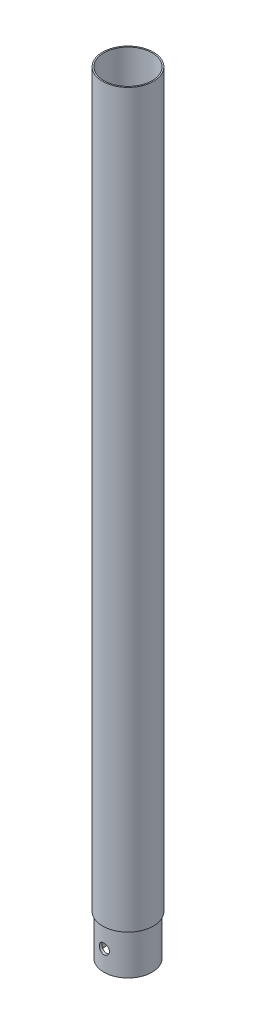
ISO-10303-21;
HEADER;
FILE_DESCRIPTION(('STEP AP214'),'2;1');
FILE_NAME('part.step','',(''),(''),'','','');
FILE_SCHEMA(('AUTOMOTIVE_DESIGN { 1 0 10303 214 1 1 1 1 }'));
ENDSEC;
DATA;
#1=APPLICATION_CONTEXT('core data for automotive mechanical design processes');
#2=APPLICATION_PROTOCOL_DEFINITION('international standard','automotive_design',2000,#1);
#3=PRODUCT_CONTEXT('',#1,'mechanical');
#4=PRODUCT('Part','Part','',(#3));
#5=PRODUCT_RELATED_PRODUCT_CATEGORY('part','',(#4));
#6=PRODUCT_DEFINITION_FORMATION('','',#4);
#7=PRODUCT_DEFINITION_CONTEXT('part definition',#1,'design');
#8=PRODUCT_DEFINITION('design','',#6,#7);
#9=PRODUCT_DEFINITION_SHAPE('','',#8);
#10=(LENGTH_UNIT() NAMED_UNIT(*) SI_UNIT(.MILLI.,.METRE.));
#11=(NAMED_UNIT(*) PLANE_ANGLE_UNIT() SI_UNIT($,.RADIAN.));
#12=(NAMED_UNIT(*) SI_UNIT($,.STERADIAN.) SOLID_ANGLE_UNIT());
#13=UNCERTAINTY_MEASURE_WITH_UNIT(LENGTH_MEASURE(1.E-05),#10,'distance_accuracy_value','');
#14=(GEOMETRIC_REPRESENTATION_CONTEXT(3) GLOBAL_UNCERTAINTY_ASSIGNED_CONTEXT((#13)) GLOBAL_UNIT_ASSIGNED_CONTEXT((#10,
#11,#12)) REPRESENTATION_CONTEXT('',''));
#15=CARTESIAN_POINT('',(0.,0.,0.));
#16=DIRECTION('',(0.,0.,1.));
#17=DIRECTION('',(1.,0.,0.));
#18=AXIS2_PLACEMENT_3D('',#15,#16,#17);
#19=CARTESIAN_POINT('',(0.,914.4,0.));
#20=DIRECTION('',(0.,-1.,0.));
#21=DIRECTION('',(0.,0.,-1.));
#22=AXIS2_PLACEMENT_3D('',#19,#20,#21);
#23=CYLINDRICAL_SURFACE('',#22,30.1625);
#24=CARTESIAN_POINT('',(0.,914.4,0.));
#25=DIRECTION('',(0.,1.,0.));
#26=DIRECTION('',(0.,0.,1.));
#27=AXIS2_PLACEMENT_3D('',#24,#25,#26);
#28=CIRCLE('',#27,30.1625);
#29=CARTESIAN_POINT('',(0.,914.4,30.1625));
#30=VERTEX_POINT('',#29);
#31=EDGE_CURVE('E56',#30,#30,#28,.T.);
#32=ORIENTED_EDGE('',*,*,#31,.T.);
#33=EDGE_LOOP('',(#32));
#34=FACE_BOUND('',#33,.T.);
#35=CARTESIAN_POINT('',(0.,25.4,0.));
#36=DIRECTION('',(0.,-1.,0.));
#37=DIRECTION('',(0.,0.,-1.));
#38=AXIS2_PLACEMENT_3D('',#35,#36,#37);
#39=CIRCLE('',#38,30.1625);
#40=CARTESIAN_POINT('',(0.,25.4,-30.1625));
#41=VERTEX_POINT('',#40);
#42=EDGE_CURVE('E121',#41,#41,#39,.T.);
#43=ORIENTED_EDGE('',*,*,#42,.T.);
#44=EDGE_LOOP('',(#43));
#45=FACE_BOUND('',#44,.T.);
#46=ADVANCED_FACE('F37',(#34,#45),#23,.F.);
#47=CARTESIAN_POINT('',(0.,914.4,0.));
#48=DIRECTION('',(0.,1.,0.));
#49=DIRECTION('',(0.,0.,1.));
#50=AXIS2_PLACEMENT_3D('',#47,#48,#49);
#51=PLANE('',#50);
#52=CARTESIAN_POINT('',(0.,914.4,0.));
#53=DIRECTION('',(0.,1.,0.));
#54=DIRECTION('',(0.,0.,1.));
#55=AXIS2_PLACEMENT_3D('',#52,#53,#54);
#56=CIRCLE('',#55,31.75);
#57=CARTESIAN_POINT('',(0.,914.4,31.75));
#58=VERTEX_POINT('',#57);
#59=EDGE_CURVE('E10',#58,#58,#56,.T.);
#60=ORIENTED_EDGE('',*,*,#59,.T.);
#61=EDGE_LOOP('',(#60));
#62=FACE_BOUND('',#61,.T.);
#63=ORIENTED_EDGE('',*,*,#31,.F.);
#64=EDGE_LOOP('',(#63));
#65=FACE_BOUND('',#64,.T.);
#66=ADVANCED_FACE('F97',(#62,#65),#51,.T.);
#67=CARTESIAN_POINT('',(0.,0.,0.));
#68=DIRECTION('',(0.,1.,0.));
#69=DIRECTION('',(0.,0.,1.));
#70=AXIS2_PLACEMENT_3D('',#67,#68,#69);
#71=PLANE('',#70);
#72=CARTESIAN_POINT('',(0.,0.,0.));
#73=DIRECTION('',(0.,1.,0.));
#74=DIRECTION('',(0.,0.,1.));
#75=AXIS2_PLACEMENT_3D('',#72,#73,#74);
#76=CIRCLE('',#75,31.75);
#77=CARTESIAN_POINT('',(0.,0.,31.75));
#78=VERTEX_POINT('',#77);
#79=EDGE_CURVE('E50',#78,#78,#76,.T.);
#80=ORIENTED_EDGE('',*,*,#79,.F.);
#81=EDGE_LOOP('',(#80));
#82=FACE_BOUND('',#81,.T.);
#83=CARTESIAN_POINT('',(0.,0.,0.));
#84=DIRECTION('',(0.,1.,0.));
#85=DIRECTION('',(0.,0.,1.));
#86=AXIS2_PLACEMENT_3D('',#83,#84,#85);
#87=CIRCLE('',#86,30.1625);
#88=CARTESIAN_POINT('',(0.,0.,30.1625));
#89=VERTEX_POINT('',#88);
#90=EDGE_CURVE('E111',#89,#89,#87,.F.);
#91=ORIENTED_EDGE('',*,*,#90,.F.);
#92=EDGE_LOOP('',(#91));
#93=FACE_BOUND('',#92,.T.);
#94=ADVANCED_FACE('F100',(#82,#93),#71,.F.);
#95=CARTESIAN_POINT('',(0.,914.4,0.));
#96=DIRECTION('',(0.,-1.,0.));
#97=DIRECTION('',(0.,0.,-1.));
#98=AXIS2_PLACEMENT_3D('',#95,#96,#97);
#99=CYLINDRICAL_SURFACE('',#98,31.75);
#100=ORIENTED_EDGE('',*,*,#59,.F.);
#101=EDGE_LOOP('',(#100));
#102=FACE_BOUND('',#101,.T.);
#103=ORIENTED_EDGE('',*,*,#79,.T.);
#104=EDGE_LOOP('',(#103));
#105=FACE_BOUND('',#104,.T.);
#106=ADVANCED_FACE('F39',(#102,#105),#99,.T.);
#107=CARTESIAN_POINT('',(0.,-50.8,0.));
#108=DIRECTION('',(0.,1.,0.));
#109=DIRECTION('',(0.,0.,1.));
#110=AXIS2_PLACEMENT_3D('',#107,#108,#109);
#111=CYLINDRICAL_SURFACE('',#110,30.1625);
#112=CARTESIAN_POINT('',(0.,-31.75,30.1625));
#113=CARTESIAN_POINT('',(-0.176315105581047,-31.7500038197238,30.1625020231407));
#114=CARTESIAN_POINT('',(-0.352583630866825,-31.7426548614869,30.1609514173855));
#115=CARTESIAN_POINT('',(-0.703897789038372,-31.7133258197453,30.1547967086032));
#116=CARTESIAN_POINT('',(-0.8789432238277,-31.6913434192252,30.1501921220184));
#117=CARTESIAN_POINT('',(-1.22657599671622,-31.6329046151628,30.1380522865016));
#118=CARTESIAN_POINT('',(-1.39916212229057,-31.5964413115052,30.1305156404852));
#119=CARTESIAN_POINT('',(-1.74063668820986,-31.5093160171708,30.112718738428));
#120=CARTESIAN_POINT('',(-1.90952374408857,-31.4586488050342,30.1024574808736));
#121=CARTESIAN_POINT('',(-2.24212101529348,-31.343594562264,30.0795121681272));
#122=CARTESIAN_POINT('',(-2.40583811162263,-31.2792267339408,30.0668315064394));
#123=CARTESIAN_POINT('',(-2.72728401378382,-31.1371865356579,30.0393801713236));
#124=CARTESIAN_POINT('',(-2.88501058459432,-31.0595092584672,30.0246087273689));
#125=CARTESIAN_POINT('',(-3.19328883502723,-30.8914672086765,29.9933877501161));
#126=CARTESIAN_POINT('',(-3.34384356997194,-30.8011079047624,29.9769389409554));
#127=CARTESIAN_POINT('',(-3.63691437027288,-30.6082756110029,29.9427960683608));
#128=CARTESIAN_POINT('',(-3.77942740100862,-30.5057980927871,29.9251015404287));
#129=CARTESIAN_POINT('',(-4.05722294406256,-30.2880458405658,29.8887140855167));
#130=CARTESIAN_POINT('',(-4.1923872320363,-30.1726219290865,29.8700111626939));
#131=CARTESIAN_POINT('',(-4.4525975028409,-29.9308311362274,29.8323327103976));
#132=CARTESIAN_POINT('',(-4.5776397166077,-29.8044602145386,29.8133570824482));
#133=CARTESIAN_POINT('',(-4.81667675278572,-29.5416978740834,29.7756724710714));
#134=CARTESIAN_POINT('',(-4.93067468377867,-29.405309294053,29.7569634138857));
#135=CARTESIAN_POINT('',(-5.14692431455582,-29.1233386105723,29.720323204076));
#136=CARTESIAN_POINT('',(-5.24917166601173,-28.9777531344763,29.7023923409424));
#137=CARTESIAN_POINT('',(-5.44209942500296,-28.6769332506845,29.6676535448939));
#138=CARTESIAN_POINT('',(-5.53265630322925,-28.5216180886506,29.6508583771763));
#139=CARTESIAN_POINT('',(-5.70037480860366,-28.2036677315623,29.6190719167317));
#140=CARTESIAN_POINT('',(-5.77753140262471,-28.041029814849,29.6040813024381));
#141=CARTESIAN_POINT('',(-5.9177864070758,-27.7096813827476,29.576364509607));
#142=CARTESIAN_POINT('',(-5.98089123313174,-27.540973679684,29.5636372982026));
#143=CARTESIAN_POINT('',(-6.0926059238663,-27.1986540259453,29.5408150837068));
#144=CARTESIAN_POINT('',(-6.14121054241279,-27.0250403251037,29.5307210334509));
#145=CARTESIAN_POINT('',(-6.2633701327077,-26.5037887429272,29.5051501977688));
#146=CARTESIAN_POINT('',(-6.31547177218477,-26.1505200579255,29.493933901796));
#147=CARTESIAN_POINT('',(-6.34875323458613,-25.6182800597736,29.4867710600427));
#148=CARTESIAN_POINT('',(-6.35236099804858,-25.4404054966268,29.4859953409579));
#149=CARTESIAN_POINT('',(-6.34466946257648,-25.0849720693957,29.4876516760316));
#150=CARTESIAN_POINT('',(-6.33336995069971,-24.9074132098574,29.490083776012));
#151=CARTESIAN_POINT('',(-6.27777817644327,-24.383228222685,29.5019937841399));
#152=CARTESIAN_POINT('',(-6.21217509172752,-24.0387250780082,29.5160050568088));
#153=CARTESIAN_POINT('',(-6.02553232151055,-23.365907889115,29.5546656900087));
#154=CARTESIAN_POINT('',(-5.9044897321428,-23.0375946939101,29.5793156077776));
#155=CARTESIAN_POINT('',(-5.60947409053115,-22.4034275223133,29.636681065321));
#156=CARTESIAN_POINT('',(-5.43511465051721,-22.0977584336578,29.6694551412393));
#157=CARTESIAN_POINT('',(-5.03868775423322,-21.5196610271918,29.7393412462841));
#158=CARTESIAN_POINT('',(-4.81661425005183,-21.2472369301612,29.7764538250576));
#159=CARTESIAN_POINT('',(-4.32578890271529,-20.7376333190208,29.8517451097226));
#160=CARTESIAN_POINT('',(-4.05619277705206,-20.5012671109709,29.8899302981544));
#161=CARTESIAN_POINT('',(-3.48076362784373,-20.0769772594501,29.962387227403));
#162=CARTESIAN_POINT('',(-3.17493003826804,-19.8890543728113,29.9966589070742));
#163=CARTESIAN_POINT('',(-2.53475473172088,-19.5668061630512,30.0575259987328));
#164=CARTESIAN_POINT('',(-2.20036098126263,-19.4325813133261,30.0841069953545));
#165=CARTESIAN_POINT('',(-1.51308346797583,-19.2224472855836,30.126489708063));
#166=CARTESIAN_POINT('',(-1.16020219877873,-19.1465302644177,30.1422928738738));
#167=CARTESIAN_POINT('',(-0.452949245360638,-19.0563356919567,30.1611349793477));
#168=CARTESIAN_POINT('',(-0.0987253228146216,-19.0409461597901,30.1644041585858));
#169=CARTESIAN_POINT('',(0.607231988982623,-19.069238200403,30.158452587199));
#170=CARTESIAN_POINT('',(0.958965532733967,-19.1129160758539,30.1492326183332));
#171=CARTESIAN_POINT('',(1.64631670192574,-19.2571797995832,30.1194834755954));
#172=CARTESIAN_POINT('',(1.98206095756056,-19.3571880888697,30.0990691336067));
#173=CARTESIAN_POINT('',(2.63201209537692,-19.6106384055554,30.0492139250055));
#174=CARTESIAN_POINT('',(2.9462172360319,-19.764084747558,30.0197723295529));
#175=CARTESIAN_POINT('',(3.54880901660522,-20.1224072900557,29.9545578294416));
#176=CARTESIAN_POINT('',(3.8367940812587,-20.3279439762805,29.9187055031452));
#177=CARTESIAN_POINT('',(4.37458849974109,-20.783753999732,29.844818666477));
#178=CARTESIAN_POINT('',(4.62439327841342,-21.034032690624,29.806783895332));
#179=CARTESIAN_POINT('',(5.08306808898007,-21.5772414172944,29.7320340135307));
#180=CARTESIAN_POINT('',(5.29117075575876,-21.8708236985533,29.695352291141));
#181=CARTESIAN_POINT('',(5.65516259700216,-22.4896277032298,29.6281962475143));
#182=CARTESIAN_POINT('',(5.81105396539953,-22.8148480964643,29.5977216654726));
#183=CARTESIAN_POINT('',(6.00171138025364,-23.3181531115434,29.5594306086357));
#184=CARTESIAN_POINT('',(6.05798943106914,-23.4881042506157,29.547921198351));
#185=CARTESIAN_POINT('',(6.15603205146513,-23.8322866813607,29.5276516233052));
#186=CARTESIAN_POINT('',(6.19780197884528,-24.0065163674756,29.518890443748));
#187=CARTESIAN_POINT('',(6.26648482846388,-24.3580053657795,29.5043861459545));
#188=CARTESIAN_POINT('',(6.29339667556468,-24.5352648962528,29.4986432461238));
#189=CARTESIAN_POINT('',(6.33214158482362,-24.8914967282123,29.4903507157791));
#190=CARTESIAN_POINT('',(6.34397523447174,-25.0704689626928,29.4878009608511));
#191=CARTESIAN_POINT('',(6.35237772348669,-25.4251718698303,29.4859919192306));
#192=CARTESIAN_POINT('',(6.34924961534649,-25.6008951202917,29.4866673063804));
#193=CARTESIAN_POINT('',(6.3284472667739,-25.9514357677677,29.491138915751));
#194=CARTESIAN_POINT('',(6.31077331058212,-26.1262531824161,29.4949350769887));
#195=CARTESIAN_POINT('',(6.26101842486044,-26.4737614180177,29.5055367648539));
#196=CARTESIAN_POINT('',(6.22893509463876,-26.6464518796796,29.5123427929412));
#197=CARTESIAN_POINT('',(6.1506305563073,-26.9883945531221,29.5287613574746));
#198=CARTESIAN_POINT('',(6.1044143780484,-27.1576479653246,29.5383728953905));
#199=CARTESIAN_POINT('',(5.99834014794418,-27.4911613434239,29.5600954258912));
#200=CARTESIAN_POINT('',(5.93851856446133,-27.6554333512606,29.5721997287382));
#201=CARTESIAN_POINT('',(5.80563709200432,-27.9782823954543,29.5985737402857));
#202=CARTESIAN_POINT('',(5.7325818677565,-28.1368614150079,29.6128426856842));
#203=CARTESIAN_POINT('',(5.573713318327,-28.447400782635,29.6431554436397));
#204=CARTESIAN_POINT('',(5.48789460435568,-28.5993582998784,29.6592000051323));
#205=CARTESIAN_POINT('',(5.30415363599656,-28.8955423551511,29.6926097379869));
#206=CARTESIAN_POINT('',(5.206235499775,-29.0397714997831,29.7099744592486));
#207=CARTESIAN_POINT('',(4.99694772485927,-29.322309111402,29.745897252342));
#208=CARTESIAN_POINT('',(4.88535643217662,-29.4604513448569,29.7644718069787));
#209=CARTESIAN_POINT('',(4.65107056987712,-29.7268342731341,29.8019800349832));
#210=CARTESIAN_POINT('',(4.52837989048098,-29.8550784081577,29.8209135807034));
#211=CARTESIAN_POINT('',(4.27260929921923,-30.1009354239142,29.8586324487833));
#212=CARTESIAN_POINT('',(4.13952328824615,-30.2185419747568,29.8774176768978));
#213=CARTESIAN_POINT('',(3.86396396818016,-30.4421979437339,29.9143026256864));
#214=CARTESIAN_POINT('',(3.72149412610624,-30.5482515922791,29.9324025956917));
#215=CARTESIAN_POINT('',(3.42627478682687,-30.7493388090298,29.9676393715762));
#216=CARTESIAN_POINT('',(3.27342085374657,-30.8442216881643,29.9847616854536));
#217=CARTESIAN_POINT('',(2.96013530544962,-31.0207129077949,30.0173083006279));
#218=CARTESIAN_POINT('',(2.79970651008203,-31.102326138607,30.0327332267893));
#219=CARTESIAN_POINT('',(2.47242690886246,-31.2516605860783,30.0614448140426));
#220=CARTESIAN_POINT('',(2.30557984372941,-31.3193897532632,30.0747326979389));
#221=CARTESIAN_POINT('',(1.96663020987741,-31.4404689938892,30.0987984120681));
#222=CARTESIAN_POINT('',(1.79452861884826,-31.4938217243652,30.1095767060701));
#223=CARTESIAN_POINT('',(1.35660918173222,-31.6093837089532,30.13313145727));
#224=CARTESIAN_POINT('',(1.08810836381504,-31.6620393420907,30.1440853549386));
#225=CARTESIAN_POINT('',(0.546367649735176,-31.7323438568515,30.1587679205484));
#226=CARTESIAN_POINT('',(0.27312793598277,-31.7499940829047,30.1624968659733));
#227=CARTESIAN_POINT('',(0.,-31.75,30.1625));
#228=B_SPLINE_CURVE_WITH_KNOTS('',3,(#112,#113,#114,#115,#116,#117,#118,#119,#120,#121,#122,
#123,#124,#125,#126,#127,#128,#129,#130,#131,#132,#133,#134,#135,#136,#137,#138,#139,#140,#141,
#142,#143,#144,#145,#146,#147,#148,#149,#150,#151,#152,#153,#154,#155,#156,#157,#158,#159,#160,
#161,#162,#163,#164,#165,#166,#167,#168,#169,#170,#171,#172,#173,#174,#175,#176,#177,#178,#179,
#180,#181,#182,#183,#184,#185,#186,#187,#188,#189,#190,#191,#192,#193,#194,#195,#196,#197,#198,
#199,#200,#201,#202,#203,#204,#205,#206,#207,#208,#209,#210,#211,#212,#213,#214,#215,#216,#217,
#218,#219,#220,#221,#222,#223,#224,#225,#226,#227),.UNSPECIFIED.,.T.,.F.,(4,2,2,2,2,2,2,2,2,2,2,
2,2,2,2,2,2,2,2,2,2,2,2,2,2,2,2,2,2,2,2,2,2,2,2,2,2,2,2,2,2,2,2,2,2,2,2,2,2,2,2,2,2,2,2,2,2,4),
(0.,0.528705328684641,1.05749439090057,1.58653572272344,2.11577178958024,2.64427092512803,
3.17296534074927,3.70143247164451,4.23009770948944,4.76564250251184,5.30138580282144,
5.8369778692316,6.37276749880098,6.91382181732159,7.45507891761494,7.99608838673802,
8.53729335476716,9.60286640188286,10.1360803671133,10.6693019490939,11.7168539086147,
12.7644607441494,13.8198471306622,14.8753673698013,15.9519853113769,17.0286200719844,
18.1072599864553,19.1857547846418,20.2443408140686,21.302860584297,22.3507198413266,
23.3986637224264,24.4606252144195,25.5227138620145,26.6028425624871,27.6829258699679,
28.2205738329393,28.7580230327478,29.2955111175363,29.8329782596011,30.3596055784277,
30.8862226066676,31.4129274051618,31.9394449682613,32.4645675311248,32.98950535244,
33.514665436817,34.0396472672245,34.5746806868894,35.1095273040407,35.6446901160257,
36.1796563000905,36.7211671142186,37.2624779086586,37.8034778573481,38.3443777504215,
39.1634212523893,39.9824332972782),.UNSPECIFIED.);
#229=CARTESIAN_POINT('',(0.,-31.75,30.1625));
#230=VERTEX_POINT('',#229);
#231=EDGE_CURVE('E84',#230,#230,#228,.T.);
#232=ORIENTED_EDGE('',*,*,#231,.T.);
#233=EDGE_LOOP('',(#232));
#234=FACE_BOUND('',#233,.T.);
#235=CARTESIAN_POINT('',(6.35,-25.4,-29.4865037983482));
#236=CARTESIAN_POINT('',(6.35000383665806,-25.2237335940409,-29.4865016033478));
#237=CARTESIAN_POINT('',(6.34265889203041,-25.0475137908717,-29.488087229197));
#238=CARTESIAN_POINT('',(6.31334629621443,-24.6962984088657,-29.4943776030288));
#239=CARTESIAN_POINT('',(6.29137632424732,-24.5213030287814,-29.4990828460487));
#240=CARTESIAN_POINT('',(6.23297149470894,-24.1737713847186,-29.5114783841454));
#241=CARTESIAN_POINT('',(6.19652965960528,-24.0012363486114,-29.5191701191035));
#242=CARTESIAN_POINT('',(6.10945733313258,-23.6598650965947,-29.5373139375905));
#243=CARTESIAN_POINT('',(6.05882161419217,-23.4910302682101,-29.5477670380413));
#244=CARTESIAN_POINT('',(5.94384340624219,-23.1585441551787,-29.5711102975904));
#245=CARTESIAN_POINT('',(5.8795207468832,-22.9948857607659,-29.5839969279812));
#246=CARTESIAN_POINT('',(5.73758185121118,-22.6735523688274,-29.6118521851701));
#247=CARTESIAN_POINT('',(5.65996070951486,-22.5158796055198,-29.6268215798491));
#248=CARTESIAN_POINT('',(5.49203959297024,-22.207699633984,-29.658408572995));
#249=CARTESIAN_POINT('',(5.40174503043408,-22.0571894034747,-29.675025466996));
#250=CARTESIAN_POINT('',(5.20904828502576,-21.7641957467521,-29.7094564303587));
#251=CARTESIAN_POINT('',(5.10664157487713,-21.6217153514967,-29.7272709462867));
#252=CARTESIAN_POINT('',(4.88896093590215,-21.3438774473538,-29.7638507239633));
#253=CARTESIAN_POINT('',(4.77353001414538,-21.2086441904622,-29.7826256642304));
#254=CARTESIAN_POINT('',(4.53171059599173,-20.9482951715349,-29.8203786408225));
#255=CARTESIAN_POINT('',(4.40531805298798,-20.8231831791044,-29.839356749864));
#256=CARTESIAN_POINT('',(4.14249851202326,-20.5840093612508,-29.8769765018139));
#257=CARTESIAN_POINT('',(4.00607444646209,-20.4699443290098,-29.8956182410807));
#258=CARTESIAN_POINT('',(3.72401887700792,-20.2535653486952,-29.9320616588801));
#259=CARTESIAN_POINT('',(3.57838399901281,-20.1512557459778,-29.9498630253484));
#260=CARTESIAN_POINT('',(3.27752308781767,-19.9582559246085,-29.9842855449464));
#261=CARTESIAN_POINT('',(3.12222003204956,-19.8676834431951,-30.0008940898636));
#262=CARTESIAN_POINT('',(2.80429233690028,-19.6999325199551,-30.0322807066711));
#263=CARTESIAN_POINT('',(2.64166497575117,-19.6227591099187,-30.0470580903066));
#264=CARTESIAN_POINT('',(2.31033793468708,-19.4824699557545,-30.0743465194566));
#265=CARTESIAN_POINT('',(2.14164103429334,-19.4193478697127,-30.0868585869193));
#266=CARTESIAN_POINT('',(1.79934571761723,-19.307598519863,-30.1092729209882));
#267=CARTESIAN_POINT('',(1.62574555002334,-19.2589765086216,-30.1191742417167));
#268=CARTESIAN_POINT('',(1.10457254652848,-19.1367710214193,-30.1442407378092));
#269=CARTESIAN_POINT('',(0.751376656671362,-19.0846338787608,-30.1552136910014));
#270=CARTESIAN_POINT('',(0.219244251289241,-19.0512809828075,-30.1622314582826));
#271=CARTESIAN_POINT('',(0.0414048725291179,-19.0476464089707,-30.1629955058067));
#272=CARTESIAN_POINT('',(-0.313961529573228,-19.0552786181092,-30.161388766788));
#273=CARTESIAN_POINT('',(-0.491488548184789,-19.0665456248551,-30.1590179331702));
#274=CARTESIAN_POINT('',(-1.015953437635,-19.12207246124,-30.1473829002697));
#275=CARTESIAN_POINT('',(-1.36077195582299,-19.1876965767385,-30.1336706056871));
#276=CARTESIAN_POINT('',(-2.03420894869433,-19.3744888849476,-30.095721967219));
#277=CARTESIAN_POINT('',(-2.36282672670044,-19.4956594640083,-30.0714851711894));
#278=CARTESIAN_POINT('',(-2.99738097422117,-19.7909492757365,-30.0149010012309));
#279=CARTESIAN_POINT('',(-3.30314610147263,-19.9654265692809,-29.9824990481209));
#280=CARTESIAN_POINT('',(-3.88138660849828,-20.3621100264074,-29.9131444896976));
#281=CARTESIAN_POINT('',(-4.15385776004847,-20.5843222423028,-29.8761913075875));
#282=CARTESIAN_POINT('',(-4.66332240686298,-21.075252240162,-29.8009650192243));
#283=CARTESIAN_POINT('',(-4.89952999090333,-21.344784560054,-29.7626802024323));
#284=CARTESIAN_POINT('',(-5.32352935017676,-21.9200274722244,-29.6897771292723));
#285=CARTESIAN_POINT('',(-5.5113200005451,-22.225738904807,-29.655158958102));
#286=CARTESIAN_POINT('',(-5.83346996153975,-22.8658689014871,-29.5934812505656));
#287=CARTESIAN_POINT('',(-5.96769032173499,-23.2003594190231,-29.5664414242292));
#288=CARTESIAN_POINT('',(-6.17778632937599,-23.8878489745664,-29.5232617556119));
#289=CARTESIAN_POINT('',(-6.25367048422846,-24.2408453057717,-29.5071203240155));
#290=CARTESIAN_POINT('',(-6.34374098447686,-24.9481704429702,-29.4878866611643));
#291=CARTESIAN_POINT('',(-6.35906754463862,-25.3023476636831,-29.4845533052486));
#292=CARTESIAN_POINT('',(-6.33066626602637,-26.0081969634689,-29.4906642086807));
#293=CARTESIAN_POINT('',(-6.2869421638387,-26.359869199636,-29.5001076595426));
#294=CARTESIAN_POINT('',(-6.14266757516395,-27.0468175166569,-29.5304812703195));
#295=CARTESIAN_POINT('',(-6.04273665172115,-27.3822297693147,-29.5512861229253));
#296=CARTESIAN_POINT('',(-5.7895509236459,-28.0315507562823,-29.6019267726508));
#297=CARTESIAN_POINT('',(-5.63629132869544,-28.3454575558039,-29.6317633810285));
#298=CARTESIAN_POINT('',(-5.27826044584435,-28.9478147185362,-29.6976406950828));
#299=CARTESIAN_POINT('',(-5.07278185285756,-29.2358353814199,-29.7337642482826));
#300=CARTESIAN_POINT('',(-4.61706154490053,-29.773728244385,-29.8079233322263));
#301=CARTESIAN_POINT('',(-4.36681469952246,-30.0235960660902,-29.8459590817467));
#302=CARTESIAN_POINT('',(-3.823585915029,-30.4824523772657,-29.9204443805716));
#303=CARTESIAN_POINT('',(-3.52994454866826,-30.6906661154427,-29.9568555289082));
#304=CARTESIAN_POINT('',(-2.91098851988656,-31.0548526582966,-30.0233079109972));
#305=CARTESIAN_POINT('',(-2.5856752752762,-31.2108278000789,-30.0533494296988));
#306=CARTESIAN_POINT('',(-2.08233454762094,-31.4015405481039,-30.091006139156));
#307=CARTESIAN_POINT('',(-1.91244492567754,-31.4578142642266,-30.1023046581251));
#308=CARTESIAN_POINT('',(-1.56839154663493,-31.5558574807939,-30.1221870584343));
#309=CARTESIAN_POINT('',(-1.39422938932691,-31.5976323239979,-30.1307719396316));
#310=CARTESIAN_POINT('',(-1.04287856401566,-31.6663359376382,-30.1449788216831));
#311=CARTESIAN_POINT('',(-0.865689646837443,-31.6932634796535,-30.1506005773755));
#312=CARTESIAN_POINT('',(-0.509600888156586,-31.7320514053268,-30.1587204347631));
#313=CARTESIAN_POINT('',(-0.330701111836807,-31.743912360728,-30.1612186549895));
#314=CARTESIAN_POINT('',(0.0240213956486572,-31.7523847115909,-30.1630018891919));
#315=CARTESIAN_POINT('',(0.199836989502212,-31.7492855640324,-30.1623478944705));
#316=CARTESIAN_POINT('',(0.550565432444156,-31.7285256116079,-30.1579846742846));
#317=CARTESIAN_POINT('',(0.725478299096514,-31.710865091139,-30.1542755084904));
#318=CARTESIAN_POINT('',(1.07317980985837,-31.6611207905052,-30.1439040163807));
#319=CARTESIAN_POINT('',(1.24596810415535,-31.6290346669768,-30.1372412102643));
#320=CARTESIAN_POINT('',(1.58810802888464,-31.550707352784,-30.1211493878471));
#321=CARTESIAN_POINT('',(1.75746086202981,-31.5044712103491,-30.1117213581307));
#322=CARTESIAN_POINT('',(2.09120621034594,-31.3983285461626,-30.0903831475907));
#323=CARTESIAN_POINT('',(2.25560983762345,-31.338455713202,-30.0784790898611));
#324=CARTESIAN_POINT('',(2.57871458866101,-31.2054494015714,-30.0525023784537));
#325=CARTESIAN_POINT('',(2.73741770230726,-31.1323206051517,-30.0384304907559));
#326=CARTESIAN_POINT('',(3.0481921851999,-30.9732850060235,-30.0084873591275));
#327=CARTESIAN_POINT('',(3.2002607506866,-30.8873728674386,-29.9926153644779));
#328=CARTESIAN_POINT('',(3.49664977748638,-30.7034282789305,-29.9595073200284));
#329=CARTESIAN_POINT('',(3.64097285783728,-30.6053999634474,-29.9422717362487));
#330=CARTESIAN_POINT('',(3.92353092367131,-30.3959868270567,-29.9065704760572));
#331=CARTESIAN_POINT('',(4.06160857506198,-30.2843924916995,-29.8880881891369));
#332=CARTESIAN_POINT('',(4.32786021630942,-30.0501139665211,-29.8506968537379));
#333=CARTESIAN_POINT('',(4.45603764735268,-29.9274336625037,-29.831787956523));
#334=CARTESIAN_POINT('',(4.70176192334798,-29.6716973760458,-29.7940481553058));
#335=CARTESIAN_POINT('',(4.81930236005058,-29.5386352277723,-29.7752173047549));
#336=CARTESIAN_POINT('',(5.0428289337983,-29.2631374724938,-29.7381760730669));
#337=CARTESIAN_POINT('',(5.14881928945951,-29.1207053185312,-29.7199654670702));
#338=CARTESIAN_POINT('',(5.34982101535136,-28.8255214264559,-29.6844466460006));
#339=CARTESIAN_POINT('',(5.44467734770877,-28.6726623354513,-29.6671526797663));
#340=CARTESIAN_POINT('',(5.62111538615028,-28.3593703324646,-29.6342288907603));
#341=CARTESIAN_POINT('',(5.70270198239748,-28.1989402387961,-29.6185984556815));
#342=CARTESIAN_POINT('',(5.85198424317087,-27.8716599404104,-29.5894656168797));
#343=CARTESIAN_POINT('',(5.91968793561648,-27.7048135126676,-29.5759619843668));
#344=CARTESIAN_POINT('',(6.04071819725221,-27.3658638493918,-29.5514792772393));
#345=CARTESIAN_POINT('',(6.09404743705064,-27.1937615969545,-29.5404997337336));
#346=CARTESIAN_POINT('',(6.20951761134411,-26.7559677721858,-29.5164944648895));
#347=CARTESIAN_POINT('',(6.26212266206019,-26.4875960682184,-29.5053128778571));
#348=CARTESIAN_POINT('',(6.33236015222137,-25.9461121803845,-29.4903193988656));
#349=CARTESIAN_POINT('',(6.34999405781042,-25.6730001957357,-29.4865071979496));
#350=CARTESIAN_POINT('',(6.35,-25.4,-29.4865037983482));
#351=B_SPLINE_CURVE_WITH_KNOTS('',3,(#235,#236,#237,#238,#239,#240,#241,#242,#243,#244,#245,
#246,#247,#248,#249,#250,#251,#252,#253,#254,#255,#256,#257,#258,#259,#260,#261,#262,#263,#264,
#265,#266,#267,#268,#269,#270,#271,#272,#273,#274,#275,#276,#277,#278,#279,#280,#281,#282,#283,
#284,#285,#286,#287,#288,#289,#290,#291,#292,#293,#294,#295,#296,#297,#298,#299,#300,#301,#302,
#303,#304,#305,#306,#307,#308,#309,#310,#311,#312,#313,#314,#315,#316,#317,#318,#319,#320,#321,
#322,#323,#324,#325,#326,#327,#328,#329,#330,#331,#332,#333,#334,#335,#336,#337,#338,#339,#340,
#341,#342,#343,#344,#345,#346,#347,#348,#349,#350),.UNSPECIFIED.,.T.,.F.,(4,2,2,2,2,2,2,2,2,2,2,
2,2,2,2,2,2,2,2,2,2,2,2,2,2,2,2,2,2,2,2,2,2,2,2,2,2,2,2,2,2,2,2,2,2,2,2,2,2,2,2,2,2,2,2,2,2,4),
(0.,0.528559023484118,1.05720194158532,1.58610005213328,2.11519321102399,2.64352497598332,
3.17205204682341,3.70035408776297,4.22885422514101,4.76459128212151,5.30052696128536,
5.83630659460283,6.37228364426645,6.91327809252619,7.45447526455433,7.99542767555786,
8.53657580601512,9.60193879122215,10.135050188525,10.668169591421,11.7166194693534,
12.7651143943115,13.8208129394646,14.8766454157812,15.9528485646359,17.0290767145352,
18.1080785173342,19.186922935034,20.2453545858797,21.3037192648101,22.3506400830396,
23.3976549665944,24.4596872221972,25.5218412639488,26.6022150922009,27.6825405790895,
28.219970466417,28.7572021028296,29.2944781815043,29.8317338711448,30.3586365592816,
30.8855289567603,31.4125069760831,31.9392972069063,32.4647998786635,32.990117293619,
33.5156545988796,34.0410130659862,34.5758739207252,35.1105480203154,35.6455421188954,
36.180340153635,36.7218717704311,37.2632033675973,37.8042210463982,38.345138140933,
39.1638010393871,39.9824296151721),.UNSPECIFIED.);
#352=CARTESIAN_POINT('',(6.35,-25.4,-29.4865037983482));
#353=VERTEX_POINT('',#352);
#354=EDGE_CURVE('E79',#353,#353,#351,.T.);
#355=ORIENTED_EDGE('',*,*,#354,.T.);
#356=EDGE_LOOP('',(#355));
#357=FACE_BOUND('',#356,.T.);
#358=CARTESIAN_POINT('',(0.,-50.8,0.));
#359=DIRECTION('',(0.,-1.,0.));
#360=DIRECTION('',(0.,0.,-1.));
#361=AXIS2_PLACEMENT_3D('',#358,#359,#360);
#362=CIRCLE('',#361,30.1625);
#363=CARTESIAN_POINT('',(0.,-50.8,-30.1625));
#364=VERTEX_POINT('',#363);
#365=EDGE_CURVE('E113',#364,#364,#362,.T.);
#366=ORIENTED_EDGE('',*,*,#365,.F.);
#367=EDGE_LOOP('',(#366));
#368=FACE_BOUND('',#367,.T.);
#369=ORIENTED_EDGE('',*,*,#90,.T.);
#370=EDGE_LOOP('',(#369));
#371=FACE_BOUND('',#370,.T.);
#372=ADVANCED_FACE('F88',(#234,#357,#368,#371),#111,.T.);
#373=CARTESIAN_POINT('',(0.,-50.8,0.));
#374=DIRECTION('',(0.,-1.,0.));
#375=DIRECTION('',(0.,0.,-1.));
#376=AXIS2_PLACEMENT_3D('',#373,#374,#375);
#377=PLANE('',#376);
#378=ORIENTED_EDGE('',*,*,#365,.T.);
#379=EDGE_LOOP('',(#378));
#380=FACE_BOUND('',#379,.T.);
#381=CARTESIAN_POINT('',(0.,-50.8,0.));
#382=DIRECTION('',(0.,-1.,0.));
#383=DIRECTION('',(0.,0.,-1.));
#384=AXIS2_PLACEMENT_3D('',#381,#382,#383);
#385=CIRCLE('',#384,26.9875);
#386=CARTESIAN_POINT('',(0.,-50.8,-26.9875));
#387=VERTEX_POINT('',#386);
#388=EDGE_CURVE('E116',#387,#387,#385,.T.);
#389=ORIENTED_EDGE('',*,*,#388,.F.);
#390=EDGE_LOOP('',(#389));
#391=FACE_BOUND('',#390,.T.);
#392=ADVANCED_FACE('F92',(#380,#391),#377,.T.);
#393=CARTESIAN_POINT('',(0.,-50.8,0.));
#394=DIRECTION('',(0.,1.,0.));
#395=DIRECTION('',(0.,0.,1.));
#396=AXIS2_PLACEMENT_3D('',#393,#394,#395);
#397=CYLINDRICAL_SURFACE('',#396,26.9875);
#398=CARTESIAN_POINT('',(0.,-31.75,26.9875));
#399=CARTESIAN_POINT('',(-0.175804949433237,-31.75000465235,26.9875026904961));
#400=CARTESIAN_POINT('',(-0.351556815474921,-31.7426976938243,26.9857794379301));
#401=CARTESIAN_POINT('',(-0.701834253428855,-31.7135405802492,26.9789404468635));
#402=CARTESIAN_POINT('',(-0.876359660947087,-31.6916885117852,26.9738242620217));
#403=CARTESIAN_POINT('',(-1.22293158118543,-31.6336049495485,26.9603356120682));
#404=CARTESIAN_POINT('',(-1.3949771389318,-31.5973680619108,26.9519619255172));
#405=CARTESIAN_POINT('',(-1.73537350078435,-31.510796093432,26.9321872268546));
#406=CARTESIAN_POINT('',(-1.90372291963887,-31.4604558209559,26.9207851000162));
#407=CARTESIAN_POINT('',(-2.23523681309363,-31.3461678675042,26.895287196093));
#408=CARTESIAN_POINT('',(-2.39840876384205,-31.2822409389519,26.8811955303528));
#409=CARTESIAN_POINT('',(-2.71879163983295,-31.1411948712173,26.8506840667258));
#410=CARTESIAN_POINT('',(-2.8760003388569,-31.064070863341,26.8342634100067));
#411=CARTESIAN_POINT('',(-3.18329557015627,-30.8972432658885,26.7995464312952));
#412=CARTESIAN_POINT('',(-3.33338484582608,-30.80754457541,26.7812508405205));
#413=CARTESIAN_POINT('',(-3.62559166147048,-30.6161386830417,26.7432600958511));
#414=CARTESIAN_POINT('',(-3.76770618170111,-30.5144269769309,26.7235644181098));
#415=CARTESIAN_POINT('',(-4.04522089327878,-30.29797425579,26.6829782584061));
#416=CARTESIAN_POINT('',(-4.18047567020517,-30.1830494225526,26.6620736218143));
#417=CARTESIAN_POINT('',(-4.44091666146715,-29.9422706399566,26.6199329026249));
#418=CARTESIAN_POINT('',(-4.5660991227693,-29.8164126528019,26.59869669997));
#419=CARTESIAN_POINT('',(-4.80548070779703,-29.5546719624547,26.5564922896178));
#420=CARTESIAN_POINT('',(-4.91968273639011,-29.4187919274919,26.535524012321));
#421=CARTESIAN_POINT('',(-5.13641007815191,-29.1378179834324,26.4944262263082));
#422=CARTESIAN_POINT('',(-5.23893106681053,-28.9927206927224,26.4742970299713));
#423=CARTESIAN_POINT('',(-5.43275286464553,-28.6924203377841,26.4352086259231));
#424=CARTESIAN_POINT('',(-5.52389538761217,-28.5371126798473,26.4162674330398));
#425=CARTESIAN_POINT('',(-5.6927784626737,-28.219079706827,26.3803882635138));
#426=CARTESIAN_POINT('',(-5.77051395896448,-28.0563516226136,26.3634510433241));
#427=CARTESIAN_POINT('',(-5.91190371270232,-27.7247243032916,26.3321060989479));
#428=CARTESIAN_POINT('',(-5.9755647314144,-27.5558280769448,26.3176971608847));
#429=CARTESIAN_POINT('',(-6.08835416699994,-27.2130333305764,26.2918313085698));
#430=CARTESIAN_POINT('',(-6.1374773572654,-27.0391330360974,26.2803754561954));
#431=CARTESIAN_POINT('',(-6.26081035882328,-26.5180942429351,26.2513788431721));
#432=CARTESIAN_POINT('',(-6.31368864766002,-26.1652450816859,26.23858709065));
#433=CARTESIAN_POINT('',(-6.34820807035994,-25.6334977554005,26.2302373325789));
#434=CARTESIAN_POINT('',(-6.35224101094792,-25.4557663693646,26.2292621333896));
#435=CARTESIAN_POINT('',(-6.34542157080312,-25.1005843757656,26.2309131423645));
#436=CARTESIAN_POINT('',(-6.33456901642036,-24.9231337715023,26.2335393925422));
#437=CARTESIAN_POINT('',(-6.2804982313631,-24.4008215006283,26.2465647053316));
#438=CARTESIAN_POINT('',(-6.2162615418477,-24.058025525123,26.2619932653711));
#439=CARTESIAN_POINT('',(-6.03296409752678,-23.3883985833357,26.3046986241881));
#440=CARTESIAN_POINT('',(-5.91389983740666,-23.0615686392949,26.3319761805062));
#441=CARTESIAN_POINT('',(-5.62321914494159,-22.4294866049318,26.3955831294156));
#442=CARTESIAN_POINT('',(-5.45113567983007,-22.1244572102914,26.4319924086355));
#443=CARTESIAN_POINT('',(-5.05962940152378,-21.5471616673542,26.5097155579128));
#444=CARTESIAN_POINT('',(-4.84019918540287,-21.2749006529569,26.551030194495));
#445=CARTESIAN_POINT('',(-4.35367928310222,-20.7636683023073,26.6351828171874));
#446=CARTESIAN_POINT('',(-4.08552994427971,-20.5257061708813,26.6780329859551));
#447=CARTESIAN_POINT('',(-3.51262988617649,-20.0979503212061,26.7594874674798));
#448=CARTESIAN_POINT('',(-3.20787828591278,-19.9081577626968,26.7980916779978));
#449=CARTESIAN_POINT('',(-2.56908584993644,-19.5818163228781,26.8668625326036));
#450=CARTESIAN_POINT('',(-2.23496644774356,-19.4454159375565,26.8970055793733));
#451=CARTESIAN_POINT('',(-1.5476781581415,-19.2309872445481,26.9452847216601));
#452=CARTESIAN_POINT('',(-1.19451249855318,-19.1529490791781,26.9634228448117));
#453=CARTESIAN_POINT('',(-0.487799583448079,-19.0589655566207,26.9853539468909));
#454=CARTESIAN_POINT('',(-0.134444986794731,-19.0416437418469,26.9894648684699));
#455=CARTESIAN_POINT('',(0.570110777003685,-19.0658310829863,26.9837768381655));
#456=CARTESIAN_POINT('',(0.921312112347453,-19.1073355834225,26.9739789870135));
#457=CARTESIAN_POINT('',(1.60691684142275,-19.2468587720654,26.941776599899));
#458=CARTESIAN_POINT('',(1.94147861011244,-19.3441405899893,26.9195365284229));
#459=CARTESIAN_POINT('',(2.5895273648155,-19.5916280880688,26.8649464559181));
#460=CARTESIAN_POINT('',(2.90301237002111,-19.7418387342534,26.8325955062719));
#461=CARTESIAN_POINT('',(3.50558925051253,-20.0936796611992,26.7605988095207));
#462=CARTESIAN_POINT('',(3.79420690359641,-20.2960991785071,26.7208439593769));
#463=CARTESIAN_POINT('',(4.33387302294823,-20.7456060570712,26.6386438733668));
#464=CARTESIAN_POINT('',(4.58491577636189,-20.9927001980335,26.5961982297884));
#465=CARTESIAN_POINT('',(5.04784953918489,-21.5308336392733,26.5122802567176));
#466=CARTESIAN_POINT('',(5.25878028482059,-21.8227051791515,26.4708486116964));
#467=CARTESIAN_POINT('',(5.62869781195414,-22.43873070382,26.3946736666342));
#468=CARTESIAN_POINT('',(5.78768691493621,-22.7628832449953,26.3599300677056));
#469=CARTESIAN_POINT('',(5.98304017430931,-23.2650729209595,26.3160162729236));
#470=CARTESIAN_POINT('',(6.0408804203648,-23.4346960264632,26.3027677147515));
#471=CARTESIAN_POINT('',(6.1420639151619,-23.7784017780089,26.2793251715264));
#472=CARTESIAN_POINT('',(6.18541260109701,-23.9524827250285,26.2691300409857));
#473=CARTESIAN_POINT('',(6.25724481186957,-24.3038434545034,26.2521123424849));
#474=CARTESIAN_POINT('',(6.28572775147354,-24.4811233626109,26.2452899073016));
#475=CARTESIAN_POINT('',(6.32758630508596,-24.8375567829104,26.2352296548451));
#476=CARTESIAN_POINT('',(6.3409625792028,-25.0167102128908,26.2319916809437));
#477=CARTESIAN_POINT('',(6.35234352260515,-25.3709783021669,26.2292378639176));
#478=CARTESIAN_POINT('',(6.3507295201104,-25.5460801290436,26.2296296840838));
#479=CARTESIAN_POINT('',(6.33305404262696,-25.8955073815115,26.2339029795149));
#480=CARTESIAN_POINT('',(6.31699287657224,-26.0698328236246,26.2377843801597));
#481=CARTESIAN_POINT('',(6.27055404215541,-26.4164834485788,26.2489214372971));
#482=CARTESIAN_POINT('',(6.24017410323864,-26.588808309742,26.2561776289343));
#483=CARTESIAN_POINT('',(6.16535983892773,-26.9301487721754,26.273845715971));
#484=CARTESIAN_POINT('',(6.12093048290152,-27.0991655211338,26.2842564955185));
#485=CARTESIAN_POINT('',(6.0185913037038,-27.4320556407132,26.3078782384357));
#486=CARTESIAN_POINT('',(5.96074088019102,-27.5959481653267,26.3210768409116));
#487=CARTESIAN_POINT('',(5.83191808289233,-27.9182001759502,26.3499191586521));
#488=CARTESIAN_POINT('',(5.76095028777524,-28.0765615697605,26.3655620204449));
#489=CARTESIAN_POINT('',(5.60636230090049,-28.3868476965605,26.3988656712718));
#490=CARTESIAN_POINT('',(5.52273654636322,-28.5387695618171,26.4165273466721));
#491=CARTESIAN_POINT('',(5.34347041541317,-28.8350836664145,26.4533711899145));
#492=CARTESIAN_POINT('',(5.24783403679963,-28.9794783886776,26.4725528510409));
#493=CARTESIAN_POINT('',(5.04276857392058,-29.2632035587934,26.5123896201504));
#494=CARTESIAN_POINT('',(4.93306699681068,-29.4023337466049,26.5330688333958));
#495=CARTESIAN_POINT('',(4.70250781668866,-29.6708577788255,26.5748997120059));
#496=CARTESIAN_POINT('',(4.58165405884129,-29.8002549513603,26.596051212638));
#497=CARTESIAN_POINT('',(4.32948324233397,-30.0485920475522,26.6382634443715));
#498=CARTESIAN_POINT('',(4.19816004936384,-30.1675257532724,26.659324114522));
#499=CARTESIAN_POINT('',(3.92602324261589,-30.3940133590835,26.700757133956));
#500=CARTESIAN_POINT('',(3.7852131149605,-30.501571402405,26.7211297319952));
#501=CARTESIAN_POINT('',(3.49266095199549,-30.7062409023915,26.7609530557326));
#502=CARTESIAN_POINT('',(3.34078034593549,-30.8031583098781,26.780383887582));
#503=CARTESIAN_POINT('',(3.02922426497811,-30.9837903684112,26.8174114613029));
#504=CARTESIAN_POINT('',(2.8695516880235,-31.0675098796661,26.8350088775279));
#505=CARTESIAN_POINT('',(2.54353870679166,-31.2211128574854,26.8678688624165));
#506=CARTESIAN_POINT('',(2.3772016010131,-31.2910030693529,26.8831325685279));
#507=CARTESIAN_POINT('',(2.03903414332544,-31.4164257817394,26.9108957881467));
#508=CARTESIAN_POINT('',(1.86720469941223,-31.4719606418382,26.9233957558791));
#509=CARTESIAN_POINT('',(1.41827037037616,-31.5961502058254,26.9516109130203));
#510=CARTESIAN_POINT('',(1.13787546128733,-31.6537508759365,26.9649899857492));
#511=CARTESIAN_POINT('',(0.571606745059653,-31.7306708663536,26.98293208352));
#512=CARTESIAN_POINT('',(0.285733261222079,-31.7499924386024,26.9874956271753));
#513=CARTESIAN_POINT('',(0.,-31.75,26.9875));
#514=B_SPLINE_CURVE_WITH_KNOTS('',3,(#398,#399,#400,#401,#402,#403,#404,#405,#406,#407,#408,
#409,#410,#411,#412,#413,#414,#415,#416,#417,#418,#419,#420,#421,#422,#423,#424,#425,#426,#427,
#428,#429,#430,#431,#432,#433,#434,#435,#436,#437,#438,#439,#440,#441,#442,#443,#444,#445,#446,
#447,#448,#449,#450,#451,#452,#453,#454,#455,#456,#457,#458,#459,#460,#461,#462,#463,#464,#465,
#466,#467,#468,#469,#470,#471,#472,#473,#474,#475,#476,#477,#478,#479,#480,#481,#482,#483,#484,
#485,#486,#487,#488,#489,#490,#491,#492,#493,#494,#495,#496,#497,#498,#499,#500,#501,#502,#503,
#504,#505,#506,#507,#508,#509,#510,#511,#512,#513),.UNSPECIFIED.,.T.,.F.,(4,2,2,2,2,2,2,2,2,2,2,
2,2,2,2,2,2,2,2,2,2,2,2,2,2,2,2,2,2,2,2,2,2,2,2,2,2,2,2,2,2,2,2,2,2,2,2,2,2,2,2,2,2,2,2,2,2,4),
(0.,0.527163350190567,1.05439606262584,1.58182665814613,2.10945166324974,2.63627648602978,
3.16329608680801,3.69011092839045,4.21712392744249,4.75264405298091,5.28836280277604,
5.82393943625614,6.35971370900117,6.90226340370131,7.44501724923979,7.98750979092962,
8.53019713206884,9.5949816659715,10.127790966889,10.6606064834623,11.7025832772039,
12.7446266973463,13.7961251605433,14.8477881506247,15.9258950525597,17.0040279087455,
18.0851383512608,19.1660661473203,20.2223246176358,21.2784995009945,22.3210326621823,
23.3636636647442,24.4230881113071,25.4826734685584,26.5650920168328,27.6474621807795,
28.1860228109154,28.7243811472028,29.2627606759381,29.8011166784624,30.3258160523019,
30.8505042063883,31.3752755892657,31.899861564406,32.4221686581483,32.9442937817133,
33.4666490328404,33.98883087383,34.5233503149802,35.0576861427091,35.5923373855475,
36.1267932228308,36.6697760602038,37.2125584712627,37.755075481603,38.2975032619962,
39.1543446985057,40.0111357259046),.UNSPECIFIED.);
#515=CARTESIAN_POINT('',(0.,-31.75,26.9875));
#516=VERTEX_POINT('',#515);
#517=EDGE_CURVE('E41',#516,#516,#514,.T.);
#518=ORIENTED_EDGE('',*,*,#517,.F.);
#519=EDGE_LOOP('',(#518));
#520=FACE_BOUND('',#519,.T.);
#521=CARTESIAN_POINT('',(6.35,-25.4,-26.2298047314501));
#522=CARTESIAN_POINT('',(6.35000468534169,-25.224270834641,-26.2298017512754));
#523=CARTESIAN_POINT('',(6.3427039497225,-25.0485948029504,-26.2315737691924));
#524=CARTESIAN_POINT('',(6.31357235185877,-24.6984711192648,-26.2386015229454));
#525=CARTESIAN_POINT('',(6.29173957092659,-24.5240236325504,-26.2438577188022));
#526=CARTESIAN_POINT('',(6.23370871217858,-24.1776090690411,-26.2577019751765));
#527=CARTESIAN_POINT('',(6.19750511175693,-24.0056429721871,-26.2662913165702));
#528=CARTESIAN_POINT('',(6.11101526346845,-23.6654073357983,-26.2865482944064));
#529=CARTESIAN_POINT('',(6.06072381445178,-23.4971391863148,-26.2982170676645));
#530=CARTESIAN_POINT('',(5.94655372642626,-23.1657983137689,-26.3242677755828));
#531=CARTESIAN_POINT('',(5.88269680922201,-23.0027177584179,-26.3386453686109));
#532=CARTESIAN_POINT('',(5.74180776273167,-22.6825101585709,-26.3697175205767));
#533=CARTESIAN_POINT('',(5.66477076764095,-22.5253853390693,-26.3864129347741));
#534=CARTESIAN_POINT('',(5.49813066943509,-22.2182435106274,-26.4216381230747));
#535=CARTESIAN_POINT('',(5.40853238080999,-22.068223807774,-26.440167193578));
#536=CARTESIAN_POINT('',(5.21733676648057,-21.7761378412428,-26.4785585078717));
#537=CARTESIAN_POINT('',(5.11573493831532,-21.6340745916266,-26.4984212507015));
#538=CARTESIAN_POINT('',(4.89939390807849,-21.3564950079397,-26.5392806468694));
#539=CARTESIAN_POINT('',(4.78445875135547,-21.2211333677557,-26.560290929597));
#540=CARTESIAN_POINT('',(4.54363668946216,-20.9604772553465,-26.6025462825732));
#541=CARTESIAN_POINT('',(4.41774573671077,-20.8351865369545,-26.6237914370423));
#542=CARTESIAN_POINT('',(4.15591738663843,-20.5955925429163,-26.6659160653237));
#543=CARTESIAN_POINT('',(4.01998280289675,-20.4812862106395,-26.6867956395359));
#544=CARTESIAN_POINT('',(3.73887799541808,-20.2643575634631,-26.7276284808659));
#545=CARTESIAN_POINT('',(3.59370438781398,-20.1617395683483,-26.747581403908));
#546=CARTESIAN_POINT('',(3.29333933227146,-19.9678043402614,-26.7862327401736));
#547=CARTESIAN_POINT('',(3.13804902824741,-19.8766365411132,-26.8049133459584));
#548=CARTESIAN_POINT('',(2.82004803990206,-19.7077012253301,-26.8402327936247));
#549=CARTESIAN_POINT('',(2.65733458620951,-19.6299387624187,-26.8568708648065));
#550=CARTESIAN_POINT('',(2.32573678595956,-19.4884945732198,-26.8876137338924));
#551=CARTESIAN_POINT('',(2.15685539695375,-19.4248061990135,-26.901719727234));
#552=CARTESIAN_POINT('',(1.81409452587016,-19.311962195404,-26.92701035073));
#553=CARTESIAN_POINT('',(1.64021326741424,-19.262811802909,-26.9381939279959));
#554=CARTESIAN_POINT('',(1.11929831270869,-19.1394096287169,-26.9664777537414));
#555=CARTESIAN_POINT('',(0.766566465441959,-19.0864777921259,-26.9789242099924));
#556=CARTESIAN_POINT('',(0.234993158846182,-19.0518487139819,-26.9870661097612));
#557=CARTESIAN_POINT('',(0.0573188003856835,-19.0477743800874,-26.9880237414169));
#558=CARTESIAN_POINT('',(-0.297754260176566,-19.0545017770728,-26.986440737527));
#559=CARTESIAN_POINT('',(-0.475152958713757,-19.065303698741,-26.9839000571154));
#560=CARTESIAN_POINT('',(-0.997895595435003,-19.1192718399235,-26.9712572087287));
#561=CARTESIAN_POINT('',(-1.34117953023131,-19.1835390215573,-26.9562406692375));
#562=CARTESIAN_POINT('',(-2.01176638965069,-19.3670628839437,-26.9145155785235));
#563=CARTESIAN_POINT('',(-2.33906852085908,-19.4863222917153,-26.887806447478));
#564=CARTESIAN_POINT('',(-2.97175935083401,-19.7774255216653,-26.8252807769399));
#565=CARTESIAN_POINT('',(-3.27694557316912,-19.9496939611736,-26.7893911053389));
#566=CARTESIAN_POINT('',(-3.8544784070168,-20.3416052610917,-26.7124165004699));
#567=CARTESIAN_POINT('',(-4.12681988809288,-20.5612555077622,-26.6713307576097));
#568=CARTESIAN_POINT('',(-4.63784019558288,-21.0479446087343,-26.5872967229832));
#569=CARTESIAN_POINT('',(-4.87555292742121,-21.3159953131141,-26.544327398563));
#570=CARTESIAN_POINT('',(-5.30285083616818,-21.8886049722145,-26.4622827730223));
#571=CARTESIAN_POINT('',(-5.4924342580189,-22.1931652576781,-26.4232076139359));
#572=CARTESIAN_POINT('',(-5.81861825227879,-22.8318808214732,-26.3533091105287));
#573=CARTESIAN_POINT('',(-5.95501071981595,-23.1661461820392,-26.3225183208127));
#574=CARTESIAN_POINT('',(-6.16938015111135,-23.8537551381771,-26.273106696477));
#575=CARTESIAN_POINT('',(-6.24736801758848,-24.2070951597638,-26.2544835905295));
#576=CARTESIAN_POINT('',(-6.3411626616695,-24.913927003409,-26.2319862909317));
#577=CARTESIAN_POINT('',(-6.35838742479879,-25.2672201837665,-26.2277758301709));
#578=CARTESIAN_POINT('',(-6.33402801575418,-25.9716309156939,-26.2336692060154));
#579=CARTESIAN_POINT('',(-6.29244857886631,-26.3227486401585,-26.2437718900359));
#580=CARTESIAN_POINT('',(-6.15289859950042,-27.0077369226678,-26.2768332330058));
#581=CARTESIAN_POINT('',(-6.05573179221622,-27.3417809052295,-26.2996085333364));
#582=CARTESIAN_POINT('',(-5.80864494417838,-27.9888442904278,-26.3552790820338));
#583=CARTESIAN_POINT('',(-5.65871922027395,-28.3018614237404,-26.3881754205833));
#584=CARTESIAN_POINT('',(-5.30733169012764,-28.9040549745013,-26.4611042183009));
#585=CARTESIAN_POINT('',(-5.10500965520633,-29.1927151104721,-26.5012520360022));
#586=CARTESIAN_POINT('',(-4.65566116935549,-29.7325113513236,-26.5838676308598));
#587=CARTESIAN_POINT('',(-4.40862824756742,-29.9836420150707,-26.6263357432027));
#588=CARTESIAN_POINT('',(-3.8704724063081,-30.446859208403,-26.7099291240514));
#589=CARTESIAN_POINT('',(-3.57850310095759,-30.6579712877503,-26.7510046840461));
#590=CARTESIAN_POINT('',(-2.96222478631188,-31.0282070466159,-26.8262246561942));
#591=CARTESIAN_POINT('',(-2.63791739702992,-31.1873333287161,-26.8603694152943));
#592=CARTESIAN_POINT('',(-2.1356604739126,-31.3827758283284,-26.9033894803527));
#593=CARTESIAN_POINT('',(-1.9661333763948,-31.4406076645001,-26.9163370081521));
#594=CARTESIAN_POINT('',(-1.62262925615754,-31.5417887668287,-26.9392235945616));
#595=CARTESIAN_POINT('',(-1.44865392312118,-31.5851434467354,-26.9491637776409));
#596=CARTESIAN_POINT('',(-1.09750967177603,-31.657004717889,-26.9657476659071));
#597=CARTESIAN_POINT('',(-0.920340575177749,-31.6855104775336,-26.9723911864659));
#598=CARTESIAN_POINT('',(-0.564132268827466,-31.7274328893436,-26.9821912452087));
#599=CARTESIAN_POINT('',(-0.38509313807905,-31.740850176372,-26.9853479301047));
#600=CARTESIAN_POINT('',(-0.0308047999810222,-31.7523388355986,-26.9880498892061));
#601=CARTESIAN_POINT('',(0.144432184683274,-31.750770947525,-26.9876800581139));
#602=CARTESIAN_POINT('',(0.494134544756554,-31.7331650556295,-26.9835424362131));
#603=CARTESIAN_POINT('',(0.668599936524852,-31.7171273600888,-26.9797747177969));
#604=CARTESIAN_POINT('',(1.01553448568031,-31.6707116621215,-26.9689446020731));
#605=CARTESIAN_POINT('',(1.18800333448666,-31.640331472488,-26.9618817022577));
#606=CARTESIAN_POINT('',(1.52963491174133,-31.5654914492796,-26.944658414551));
#607=CARTESIAN_POINT('',(1.69879879073885,-31.5210366116587,-26.9344991258055));
#608=CARTESIAN_POINT('',(2.03204896938521,-31.4185999338955,-26.9114050861201));
#609=CARTESIAN_POINT('',(2.19615266386765,-31.3606721365967,-26.898481439806));
#610=CARTESIAN_POINT('',(2.51881582513753,-31.2316589370671,-26.8701869196493));
#611=CARTESIAN_POINT('',(2.67737720957964,-31.1605781404765,-26.8548169026878));
#612=CARTESIAN_POINT('',(2.98804348993805,-31.0057320921301,-26.8220275773478));
#613=CARTESIAN_POINT('',(3.14014556067875,-30.9219613617388,-26.8046073845732));
#614=CARTESIAN_POINT('',(3.43679386043567,-30.7423779119368,-26.7681888169632));
#615=CARTESIAN_POINT('',(3.58134259167487,-30.6465692166568,-26.7491909702326));
#616=CARTESIAN_POINT('',(3.86511301504205,-30.4413029311915,-26.7096804514461));
#617=CARTESIAN_POINT('',(4.00414801994648,-30.3315918158029,-26.6891436754928));
#618=CARTESIAN_POINT('',(4.27247761559745,-30.101033376326,-26.6475050108388));
#619=CARTESIAN_POINT('',(4.40177553680787,-29.9801898916756,-26.6264033187398));
#620=CARTESIAN_POINT('',(4.64991399381546,-29.7280600291524,-26.5841928219914));
#621=CARTESIAN_POINT('',(4.76874819458084,-29.5967674154111,-26.5630840206952));
#622=CARTESIAN_POINT('',(4.99503978195127,-29.3247130132409,-26.521462406205));
#623=CARTESIAN_POINT('',(5.10250129437276,-29.1839546893272,-26.5009493788475));
#624=CARTESIAN_POINT('',(5.3070329701952,-28.8914562803014,-26.4607558848042));
#625=CARTESIAN_POINT('',(5.40390333755406,-28.7395737356,-26.4410946406988));
#626=CARTESIAN_POINT('',(5.58444201445244,-28.4280212913659,-26.4035540138907));
#627=CARTESIAN_POINT('',(5.66811518267997,-28.2683542862392,-26.3856739763153));
#628=CARTESIAN_POINT('',(5.82162842110486,-27.9423565669607,-26.3522290623081));
#629=CARTESIAN_POINT('',(5.89147534281301,-27.7760292026871,-26.3366630401373));
#630=CARTESIAN_POINT('',(6.01681608426816,-27.4378800941926,-26.308310321958));
#631=CARTESIAN_POINT('',(6.07231228236977,-27.2660592657176,-26.2955231654625));
#632=CARTESIAN_POINT('',(6.19635761675934,-26.8173213546957,-26.2666426402815));
#633=CARTESIAN_POINT('',(6.25387981522696,-26.537118255762,-26.2529172595634));
#634=CARTESIAN_POINT('',(6.33069594389527,-25.9712297664317,-26.2345010233167));
#635=CARTESIAN_POINT('',(6.34999238672385,-25.6855447376159,-26.2298095739769));
#636=CARTESIAN_POINT('',(6.35,-25.4,-26.2298047314501));
#637=B_SPLINE_CURVE_WITH_KNOTS('',3,(#521,#522,#523,#524,#525,#526,#527,#528,#529,#530,#531,
#532,#533,#534,#535,#536,#537,#538,#539,#540,#541,#542,#543,#544,#545,#546,#547,#548,#549,#550,
#551,#552,#553,#554,#555,#556,#557,#558,#559,#560,#561,#562,#563,#564,#565,#566,#567,#568,#569,
#570,#571,#572,#573,#574,#575,#576,#577,#578,#579,#580,#581,#582,#583,#584,#585,#586,#587,#588,
#589,#590,#591,#592,#593,#594,#595,#596,#597,#598,#599,#600,#601,#602,#603,#604,#605,#606,#607,
#608,#609,#610,#611,#612,#613,#614,#615,#616,#617,#618,#619,#620,#621,#622,#623,#624,#625,#626,
#627,#628,#629,#630,#631,#632,#633,#634,#635,#636),.UNSPECIFIED.,.T.,.F.,(4,2,2,2,2,2,2,2,2,2,2,
2,2,2,2,2,2,2,2,2,2,2,2,2,2,2,2,2,2,2,2,2,2,2,2,2,2,2,2,2,2,2,2,2,2,2,2,2,2,2,2,2,2,2,2,2,2,4),
(0.,0.526935648929172,1.05394088376368,1.58114883941356,2.10855169421676,2.63511632258507,
3.16187576856126,3.68843386745713,4.21519010621761,4.75100926781587,5.28702723322479,
5.82289560608268,6.35896138734704,6.90142284804483,7.44408836802772,7.98649700854981,
8.52910079957941,9.59354525831154,10.1261884179745,10.6588384088679,11.7022047453032,
12.7456228269784,13.7976267014909,14.8497946895723,15.9272444711079,17.0047335367145,
18.0863968754743,19.1678582436229,20.2239089892754,21.2798746998857,22.3209447965007,
23.3621270707483,24.4216259293839,25.4812782485718,26.5641144833077,27.6468964993528,
28.185112906467,28.7231278209306,29.2611728632615,29.799195265939,30.3242990512964,
30.8493916495111,31.3745643493676,31.8995508418956,32.4224667557484,32.9451999112229,
33.4681593933122,33.9909445198438,34.5252099196909,35.0592917419491,35.5936947205292,
36.1279031574384,36.6708908448078,37.2136781565432,37.7561958163152,38.29862350658,
39.1549047758667,40.0111297588204),.UNSPECIFIED.);
#638=CARTESIAN_POINT('',(6.35,-25.4,-26.2298047314501));
#639=VERTEX_POINT('',#638);
#640=EDGE_CURVE('E60',#639,#639,#637,.T.);
#641=ORIENTED_EDGE('',*,*,#640,.F.);
#642=EDGE_LOOP('',(#641));
#643=FACE_BOUND('',#642,.T.);
#644=ORIENTED_EDGE('',*,*,#388,.T.);
#645=EDGE_LOOP('',(#644));
#646=FACE_BOUND('',#645,.T.);
#647=CARTESIAN_POINT('',(0.,25.4,0.));
#648=DIRECTION('',(0.,-1.,0.));
#649=DIRECTION('',(0.,0.,-1.));
#650=AXIS2_PLACEMENT_3D('',#647,#648,#649);
#651=CIRCLE('',#650,26.9875);
#652=CARTESIAN_POINT('',(0.,25.4,-26.9875));
#653=VERTEX_POINT('',#652);
#654=EDGE_CURVE('E123',#653,#653,#651,.T.);
#655=ORIENTED_EDGE('',*,*,#654,.F.);
#656=EDGE_LOOP('',(#655));
#657=FACE_BOUND('',#656,.T.);
#658=ADVANCED_FACE('F64',(#520,#643,#646,#657),#397,.F.);
#659=CARTESIAN_POINT('',(0.,25.4,0.));
#660=DIRECTION('',(0.,-1.,0.));
#661=DIRECTION('',(0.,0.,-1.));
#662=AXIS2_PLACEMENT_3D('',#659,#660,#661);
#663=PLANE('',#662);
#664=ORIENTED_EDGE('',*,*,#654,.T.);
#665=EDGE_LOOP('',(#664));
#666=FACE_BOUND('',#665,.T.);
#667=ORIENTED_EDGE('',*,*,#42,.F.);
#668=EDGE_LOOP('',(#667));
#669=FACE_BOUND('',#668,.T.);
#670=ADVANCED_FACE('F73',(#666,#669),#663,.F.);
#671=CARTESIAN_POINT('',(0.,-25.4,-31.75));
#672=DIRECTION('',(0.,0.,1.));
#673=DIRECTION('',(1.,0.,0.));
#674=AXIS2_PLACEMENT_3D('',#671,#672,#673);
#675=CYLINDRICAL_SURFACE('',#674,6.35);
#676=ORIENTED_EDGE('',*,*,#640,.T.);
#677=EDGE_LOOP('',(#676));
#678=FACE_BOUND('',#677,.T.);
#679=ORIENTED_EDGE('',*,*,#354,.F.);
#680=EDGE_LOOP('',(#679));
#681=FACE_BOUND('',#680,.T.);
#682=ADVANCED_FACE('F71',(#678,#681),#675,.F.);
#683=ORIENTED_EDGE('',*,*,#517,.T.);
#684=EDGE_LOOP('',(#683));
#685=FACE_BOUND('',#684,.T.);
#686=ORIENTED_EDGE('',*,*,#231,.F.);
#687=EDGE_LOOP('',(#686));
#688=FACE_BOUND('',#687,.T.);
#689=ADVANCED_FACE('F68',(#685,#688),#675,.F.);
#690=CLOSED_SHELL('',(#46,#66,#94,#106,#372,#392,#658,#670,#682,#689));
#691=MANIFOLD_SOLID_BREP('B2',#690);
#692=ADVANCED_BREP_SHAPE_REPRESENTATION('',(#18,#691),#14);
#693=SHAPE_DEFINITION_REPRESENTATION(#9,#692);
ENDSEC;
END-ISO-10303-21;
